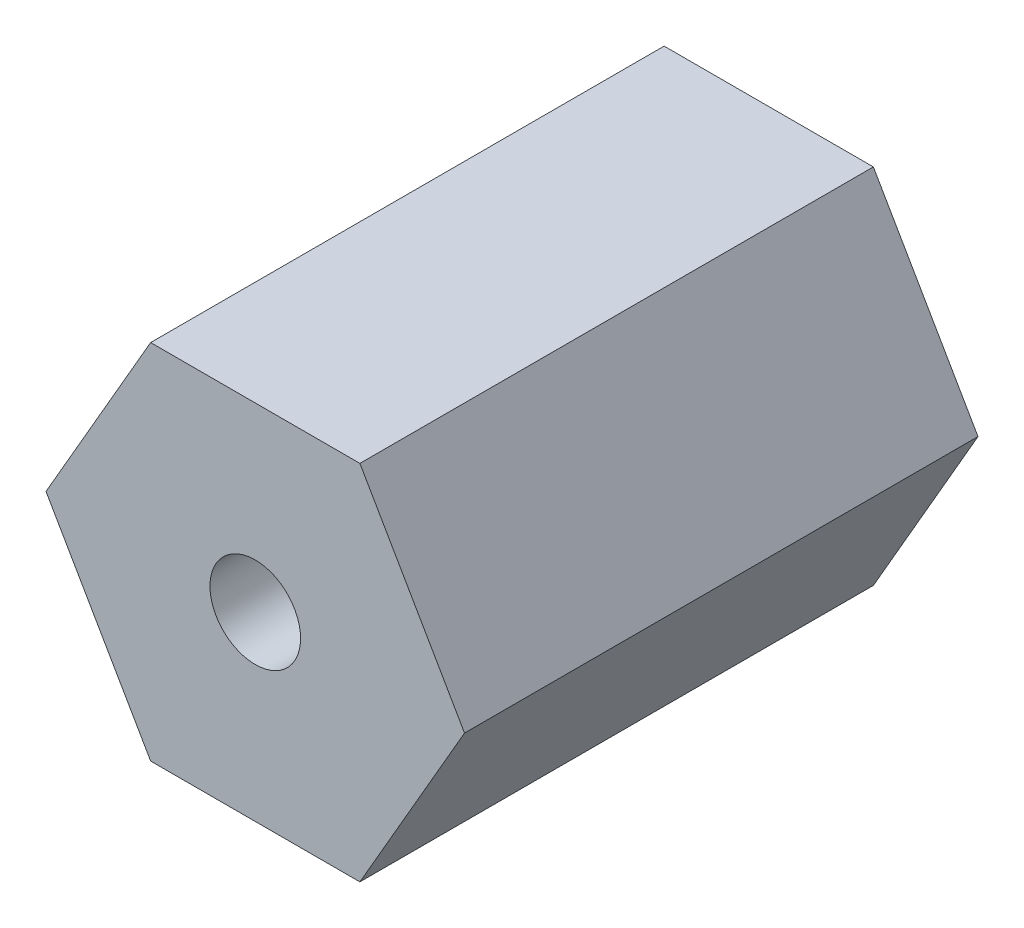
ISO-10303-21;
HEADER;
FILE_DESCRIPTION(('STEP AP214'),'2;1');
FILE_NAME('part.step','',(''),(''),'','','');
FILE_SCHEMA(('AUTOMOTIVE_DESIGN { 1 0 10303 214 1 1 1 1 }'));
ENDSEC;
DATA;
#1=APPLICATION_CONTEXT('core data for automotive mechanical design processes');
#2=APPLICATION_PROTOCOL_DEFINITION('international standard','automotive_design',2000,#1);
#3=PRODUCT_CONTEXT('',#1,'mechanical');
#4=PRODUCT('Part','Part','',(#3));
#5=PRODUCT_RELATED_PRODUCT_CATEGORY('part','',(#4));
#6=PRODUCT_DEFINITION_FORMATION('','',#4);
#7=PRODUCT_DEFINITION_CONTEXT('part definition',#1,'design');
#8=PRODUCT_DEFINITION('design','',#6,#7);
#9=PRODUCT_DEFINITION_SHAPE('','',#8);
#10=(LENGTH_UNIT() NAMED_UNIT(*) SI_UNIT(.MILLI.,.METRE.));
#11=(NAMED_UNIT(*) PLANE_ANGLE_UNIT() SI_UNIT($,.RADIAN.));
#12=(NAMED_UNIT(*) SI_UNIT($,.STERADIAN.) SOLID_ANGLE_UNIT());
#13=UNCERTAINTY_MEASURE_WITH_UNIT(LENGTH_MEASURE(1.E-05),#10,'distance_accuracy_value','');
#14=(GEOMETRIC_REPRESENTATION_CONTEXT(3) GLOBAL_UNCERTAINTY_ASSIGNED_CONTEXT((#13)) GLOBAL_UNIT_ASSIGNED_CONTEXT((#10,
#11,#12)) REPRESENTATION_CONTEXT('',''));
#15=CARTESIAN_POINT('',(0.,0.,0.));
#16=DIRECTION('',(0.,0.,1.));
#17=DIRECTION('',(1.,0.,0.));
#18=AXIS2_PLACEMENT_3D('',#15,#16,#17);
#19=CARTESIAN_POINT('',(0.,0.,17.));
#20=DIRECTION('',(0.,0.,1.));
#21=DIRECTION('',(1.,0.,0.));
#22=AXIS2_PLACEMENT_3D('',#19,#20,#21);
#23=PLANE('',#22);
#24=DIRECTION('',(0.5,0.866025403784439,0.));
#25=VECTOR('',#24,1.);
#26=CARTESIAN_POINT('',(3.46410161513775,-6.,17.));
#27=LINE('',#26,#25);
#28=CARTESIAN_POINT('',(3.46410161513775,-6.,17.));
#29=VERTEX_POINT('',#28);
#30=CARTESIAN_POINT('',(6.92820323027551,0.,17.));
#31=VERTEX_POINT('',#30);
#32=EDGE_CURVE('E129',#29,#31,#27,.T.);
#33=ORIENTED_EDGE('',*,*,#32,.T.);
#34=DIRECTION('',(-0.5,0.866025403784438,0.));
#35=VECTOR('',#34,1.);
#36=CARTESIAN_POINT('',(6.92820323027551,0.,17.));
#37=LINE('',#36,#35);
#38=CARTESIAN_POINT('',(3.46410161513775,6.00000000000001,17.));
#39=VERTEX_POINT('',#38);
#40=EDGE_CURVE('E87',#31,#39,#37,.T.);
#41=ORIENTED_EDGE('',*,*,#40,.T.);
#42=DIRECTION('',(-1.,0.,0.));
#43=VECTOR('',#42,1.);
#44=CARTESIAN_POINT('',(3.46410161513775,6.00000000000001,17.));
#45=LINE('',#44,#43);
#46=CARTESIAN_POINT('',(-3.46410161513776,6.00000000000001,17.));
#47=VERTEX_POINT('',#46);
#48=EDGE_CURVE('E100',#39,#47,#45,.T.);
#49=ORIENTED_EDGE('',*,*,#48,.T.);
#50=DIRECTION('',(-0.5,-0.866025403784439,0.));
#51=VECTOR('',#50,1.);
#52=CARTESIAN_POINT('',(-3.46410161513776,6.00000000000001,17.));
#53=LINE('',#52,#51);
#54=CARTESIAN_POINT('',(-6.92820323027551,0.,17.));
#55=VERTEX_POINT('',#54);
#56=EDGE_CURVE('E94',#47,#55,#53,.T.);
#57=ORIENTED_EDGE('',*,*,#56,.T.);
#58=DIRECTION('',(0.5,-0.866025403784439,0.));
#59=VECTOR('',#58,1.);
#60=CARTESIAN_POINT('',(-6.92820323027551,0.,17.));
#61=LINE('',#60,#59);
#62=CARTESIAN_POINT('',(-3.46410161513776,-6.,17.));
#63=VERTEX_POINT('',#62);
#64=EDGE_CURVE('E98',#55,#63,#61,.T.);
#65=ORIENTED_EDGE('',*,*,#64,.T.);
#66=DIRECTION('',(1.,0.,0.));
#67=VECTOR('',#66,1.);
#68=CARTESIAN_POINT('',(-3.46410161513776,-6.,17.));
#69=LINE('',#68,#67);
#70=EDGE_CURVE('E50',#63,#29,#69,.T.);
#71=ORIENTED_EDGE('',*,*,#70,.T.);
#72=EDGE_LOOP('',(#33,#41,#49,#57,#65,#71));
#73=FACE_BOUND('',#72,.T.);
#74=CARTESIAN_POINT('',(0.,0.,17.));
#75=DIRECTION('',(0.,0.,1.));
#76=DIRECTION('',(1.,0.,0.));
#77=AXIS2_PLACEMENT_3D('',#74,#75,#76);
#78=CIRCLE('',#77,1.5);
#79=CARTESIAN_POINT('',(1.5,0.,17.));
#80=VERTEX_POINT('',#79);
#81=EDGE_CURVE('E122',#80,#80,#78,.T.);
#82=ORIENTED_EDGE('',*,*,#81,.F.);
#83=EDGE_LOOP('',(#82));
#84=FACE_BOUND('',#83,.T.);
#85=ADVANCED_FACE('F33',(#73,#84),#23,.T.);
#86=CARTESIAN_POINT('',(0.,0.,0.));
#87=DIRECTION('',(0.,0.,1.));
#88=DIRECTION('',(1.,0.,0.));
#89=AXIS2_PLACEMENT_3D('',#86,#87,#88);
#90=PLANE('',#89);
#91=DIRECTION('',(0.5,0.866025403784439,0.));
#92=VECTOR('',#91,1.);
#93=CARTESIAN_POINT('',(3.46410161513775,-6.,0.));
#94=LINE('',#93,#92);
#95=CARTESIAN_POINT('',(3.46410161513775,-6.,0.));
#96=VERTEX_POINT('',#95);
#97=CARTESIAN_POINT('',(6.92820323027551,0.,0.));
#98=VERTEX_POINT('',#97);
#99=EDGE_CURVE('E118',#96,#98,#94,.T.);
#100=ORIENTED_EDGE('',*,*,#99,.F.);
#101=DIRECTION('',(1.,0.,0.));
#102=VECTOR('',#101,1.);
#103=CARTESIAN_POINT('',(-3.46410161513776,-6.,0.));
#104=LINE('',#103,#102);
#105=CARTESIAN_POINT('',(-3.46410161513776,-6.,0.));
#106=VERTEX_POINT('',#105);
#107=EDGE_CURVE('E79',#106,#96,#104,.T.);
#108=ORIENTED_EDGE('',*,*,#107,.F.);
#109=DIRECTION('',(0.5,-0.866025403784439,0.));
#110=VECTOR('',#109,1.);
#111=CARTESIAN_POINT('',(-6.92820323027551,0.,0.));
#112=LINE('',#111,#110);
#113=CARTESIAN_POINT('',(-6.92820323027551,0.,0.));
#114=VERTEX_POINT('',#113);
#115=EDGE_CURVE('E73',#114,#106,#112,.T.);
#116=ORIENTED_EDGE('',*,*,#115,.F.);
#117=DIRECTION('',(-0.5,-0.866025403784439,0.));
#118=VECTOR('',#117,1.);
#119=CARTESIAN_POINT('',(-3.46410161513776,6.00000000000001,0.));
#120=LINE('',#119,#118);
#121=CARTESIAN_POINT('',(-3.46410161513776,6.00000000000001,0.));
#122=VERTEX_POINT('',#121);
#123=EDGE_CURVE('E108',#122,#114,#120,.T.);
#124=ORIENTED_EDGE('',*,*,#123,.F.);
#125=DIRECTION('',(-1.,0.,0.));
#126=VECTOR('',#125,1.);
#127=CARTESIAN_POINT('',(3.46410161513775,6.00000000000001,0.));
#128=LINE('',#127,#126);
#129=CARTESIAN_POINT('',(3.46410161513775,6.00000000000001,0.));
#130=VERTEX_POINT('',#129);
#131=EDGE_CURVE('E124',#130,#122,#128,.T.);
#132=ORIENTED_EDGE('',*,*,#131,.F.);
#133=DIRECTION('',(-0.5,0.866025403784438,0.));
#134=VECTOR('',#133,1.);
#135=CARTESIAN_POINT('',(6.92820323027551,0.,0.));
#136=LINE('',#135,#134);
#137=EDGE_CURVE('E121',#98,#130,#136,.T.);
#138=ORIENTED_EDGE('',*,*,#137,.F.);
#139=EDGE_LOOP('',(#100,#108,#116,#124,#132,#138));
#140=FACE_BOUND('',#139,.T.);
#141=CARTESIAN_POINT('',(0.,0.,0.));
#142=DIRECTION('',(0.,0.,1.));
#143=DIRECTION('',(1.,0.,0.));
#144=AXIS2_PLACEMENT_3D('',#141,#142,#143);
#145=CIRCLE('',#144,1.5);
#146=CARTESIAN_POINT('',(1.5,0.,0.));
#147=VERTEX_POINT('',#146);
#148=EDGE_CURVE('E222',#147,#147,#145,.T.);
#149=ORIENTED_EDGE('',*,*,#148,.T.);
#150=EDGE_LOOP('',(#149));
#151=FACE_BOUND('',#150,.T.);
#152=ADVANCED_FACE('F138',(#140,#151),#90,.F.);
#153=CARTESIAN_POINT('',(3.46410161513775,-6.,17.));
#154=DIRECTION('',(-0.866025403784439,0.5,0.));
#155=DIRECTION('',(-0.5,-0.866025403784439,0.));
#156=AXIS2_PLACEMENT_3D('',#153,#154,#155);
#157=PLANE('',#156);
#158=ORIENTED_EDGE('',*,*,#99,.T.);
#159=DIRECTION('',(0.,0.,-1.));
#160=VECTOR('',#159,1.);
#161=CARTESIAN_POINT('',(6.92820323027551,0.,17.));
#162=LINE('',#161,#160);
#163=EDGE_CURVE('E11',#31,#98,#162,.T.);
#164=ORIENTED_EDGE('',*,*,#163,.F.);
#165=ORIENTED_EDGE('',*,*,#32,.F.);
#166=DIRECTION('',(0.,0.,-1.));
#167=VECTOR('',#166,1.);
#168=CARTESIAN_POINT('',(3.46410161513775,-6.,17.));
#169=LINE('',#168,#167);
#170=EDGE_CURVE('E114',#29,#96,#169,.T.);
#171=ORIENTED_EDGE('',*,*,#170,.T.);
#172=EDGE_LOOP('',(#158,#164,#165,#171));
#173=FACE_BOUND('',#172,.T.);
#174=ADVANCED_FACE('F35',(#173),#157,.F.);
#175=CARTESIAN_POINT('',(6.92820323027551,0.,17.));
#176=DIRECTION('',(-0.866025403784439,-0.5,0.));
#177=DIRECTION('',(0.5,-0.866025403784438,0.));
#178=AXIS2_PLACEMENT_3D('',#175,#176,#177);
#179=PLANE('',#178);
#180=ORIENTED_EDGE('',*,*,#137,.T.);
#181=DIRECTION('',(0.,0.,-1.));
#182=VECTOR('',#181,1.);
#183=CARTESIAN_POINT('',(3.46410161513775,6.00000000000001,17.));
#184=LINE('',#183,#182);
#185=EDGE_CURVE('E42',#39,#130,#184,.T.);
#186=ORIENTED_EDGE('',*,*,#185,.F.);
#187=ORIENTED_EDGE('',*,*,#40,.F.);
#188=ORIENTED_EDGE('',*,*,#163,.T.);
#189=EDGE_LOOP('',(#180,#186,#187,#188));
#190=FACE_BOUND('',#189,.T.);
#191=ADVANCED_FACE('F163',(#190),#179,.F.);
#192=CARTESIAN_POINT('',(3.46410161513775,6.00000000000001,17.));
#193=DIRECTION('',(0.,-1.,0.));
#194=DIRECTION('',(0.,0.,-1.));
#195=AXIS2_PLACEMENT_3D('',#192,#193,#194);
#196=PLANE('',#195);
#197=ORIENTED_EDGE('',*,*,#131,.T.);
#198=DIRECTION('',(0.,0.,-1.));
#199=VECTOR('',#198,1.);
#200=CARTESIAN_POINT('',(-3.46410161513776,6.00000000000001,17.));
#201=LINE('',#200,#199);
#202=EDGE_CURVE('E109',#47,#122,#201,.T.);
#203=ORIENTED_EDGE('',*,*,#202,.F.);
#204=ORIENTED_EDGE('',*,*,#48,.F.);
#205=ORIENTED_EDGE('',*,*,#185,.T.);
#206=EDGE_LOOP('',(#197,#203,#204,#205));
#207=FACE_BOUND('',#206,.T.);
#208=ADVANCED_FACE('F135',(#207),#196,.F.);
#209=CARTESIAN_POINT('',(-3.46410161513776,6.00000000000001,17.));
#210=DIRECTION('',(0.866025403784439,-0.5,0.));
#211=DIRECTION('',(0.5,0.866025403784439,0.));
#212=AXIS2_PLACEMENT_3D('',#209,#210,#211);
#213=PLANE('',#212);
#214=ORIENTED_EDGE('',*,*,#123,.T.);
#215=DIRECTION('',(0.,0.,-1.));
#216=VECTOR('',#215,1.);
#217=CARTESIAN_POINT('',(-6.92820323027551,0.,17.));
#218=LINE('',#217,#216);
#219=EDGE_CURVE('E105',#55,#114,#218,.T.);
#220=ORIENTED_EDGE('',*,*,#219,.F.);
#221=ORIENTED_EDGE('',*,*,#56,.F.);
#222=ORIENTED_EDGE('',*,*,#202,.T.);
#223=EDGE_LOOP('',(#214,#220,#221,#222));
#224=FACE_BOUND('',#223,.T.);
#225=ADVANCED_FACE('F106',(#224),#213,.F.);
#226=CARTESIAN_POINT('',(-6.92820323027551,0.,17.));
#227=DIRECTION('',(0.866025403784439,0.5,0.));
#228=DIRECTION('',(-0.5,0.866025403784439,0.));
#229=AXIS2_PLACEMENT_3D('',#226,#227,#228);
#230=PLANE('',#229);
#231=ORIENTED_EDGE('',*,*,#115,.T.);
#232=DIRECTION('',(0.,0.,-1.));
#233=VECTOR('',#232,1.);
#234=CARTESIAN_POINT('',(-3.46410161513776,-6.,17.));
#235=LINE('',#234,#233);
#236=EDGE_CURVE('E110',#63,#106,#235,.T.);
#237=ORIENTED_EDGE('',*,*,#236,.F.);
#238=ORIENTED_EDGE('',*,*,#64,.F.);
#239=ORIENTED_EDGE('',*,*,#219,.T.);
#240=EDGE_LOOP('',(#231,#237,#238,#239));
#241=FACE_BOUND('',#240,.T.);
#242=ADVANCED_FACE('F112',(#241),#230,.F.);
#243=CARTESIAN_POINT('',(-3.46410161513776,-6.,17.));
#244=DIRECTION('',(0.,1.,0.));
#245=DIRECTION('',(-1.,0.,0.));
#246=AXIS2_PLACEMENT_3D('',#243,#244,#245);
#247=PLANE('',#246);
#248=ORIENTED_EDGE('',*,*,#107,.T.);
#249=ORIENTED_EDGE('',*,*,#170,.F.);
#250=ORIENTED_EDGE('',*,*,#70,.F.);
#251=ORIENTED_EDGE('',*,*,#236,.T.);
#252=EDGE_LOOP('',(#248,#249,#250,#251));
#253=FACE_BOUND('',#252,.T.);
#254=ADVANCED_FACE('F143',(#253),#247,.F.);
#255=CARTESIAN_POINT('',(0.,0.,17.));
#256=DIRECTION('',(0.,0.,-1.));
#257=DIRECTION('',(-1.,0.,0.));
#258=AXIS2_PLACEMENT_3D('',#255,#256,#257);
#259=CYLINDRICAL_SURFACE('',#258,1.5);
#260=ORIENTED_EDGE('',*,*,#81,.T.);
#261=EDGE_LOOP('',(#260));
#262=FACE_BOUND('',#261,.T.);
#263=ORIENTED_EDGE('',*,*,#148,.F.);
#264=EDGE_LOOP('',(#263));
#265=FACE_BOUND('',#264,.T.);
#266=ADVANCED_FACE('F145',(#262,#265),#259,.F.);
#267=CLOSED_SHELL('',(#85,#152,#174,#191,#208,#225,#242,#254,#266));
#268=MANIFOLD_SOLID_BREP('B2',#267);
#269=ADVANCED_BREP_SHAPE_REPRESENTATION('',(#18,#268),#14);
#270=SHAPE_DEFINITION_REPRESENTATION(#9,#269);
ENDSEC;
END-ISO-10303-21;
